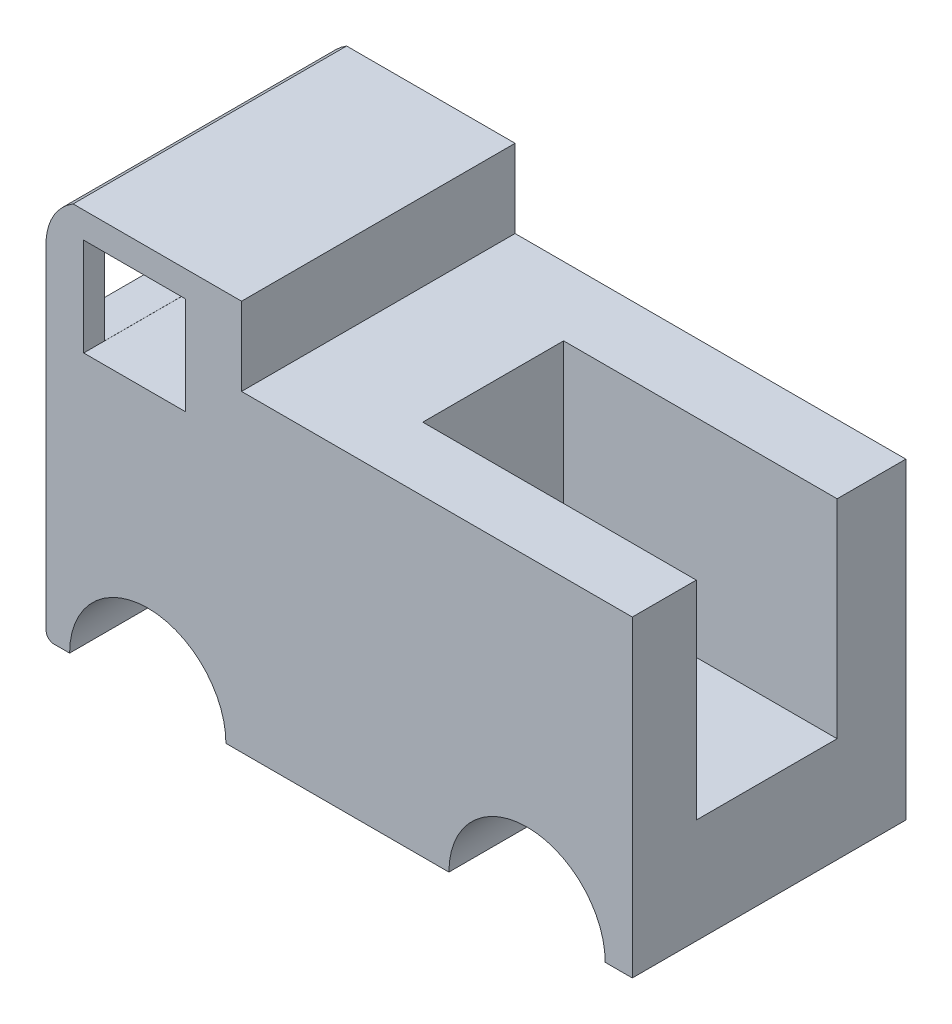
ISO-10303-21;
HEADER;
FILE_DESCRIPTION(('STEP AP214'),'2;1');
FILE_NAME('part.step','',(''),(''),'','','');
FILE_SCHEMA(('AUTOMOTIVE_DESIGN { 1 0 10303 214 1 1 1 1 }'));
ENDSEC;
DATA;
#1=APPLICATION_CONTEXT('core data for automotive mechanical design processes');
#2=APPLICATION_PROTOCOL_DEFINITION('international standard','automotive_design',2000,#1);
#3=PRODUCT_CONTEXT('',#1,'mechanical');
#4=PRODUCT('Part','Part','',(#3));
#5=PRODUCT_RELATED_PRODUCT_CATEGORY('part','',(#4));
#6=PRODUCT_DEFINITION_FORMATION('','',#4);
#7=PRODUCT_DEFINITION_CONTEXT('part definition',#1,'design');
#8=PRODUCT_DEFINITION('design','',#6,#7);
#9=PRODUCT_DEFINITION_SHAPE('','',#8);
#10=(LENGTH_UNIT() NAMED_UNIT(*) SI_UNIT(.MILLI.,.METRE.));
#11=(NAMED_UNIT(*) PLANE_ANGLE_UNIT() SI_UNIT($,.RADIAN.));
#12=(NAMED_UNIT(*) SI_UNIT($,.STERADIAN.) SOLID_ANGLE_UNIT());
#13=UNCERTAINTY_MEASURE_WITH_UNIT(LENGTH_MEASURE(1.E-05),#10,'distance_accuracy_value','');
#14=(GEOMETRIC_REPRESENTATION_CONTEXT(3) GLOBAL_UNCERTAINTY_ASSIGNED_CONTEXT((#13)) GLOBAL_UNIT_ASSIGNED_CONTEXT((#10,
#11,#12)) REPRESENTATION_CONTEXT('',''));
#15=CARTESIAN_POINT('',(0.,0.,0.));
#16=DIRECTION('',(0.,0.,1.));
#17=DIRECTION('',(1.,0.,0.));
#18=AXIS2_PLACEMENT_3D('',#15,#16,#17);
#19=CARTESIAN_POINT('',(10.0000000000002,-500.,-700.));
#20=DIRECTION('',(0.,0.,1.));
#21=DIRECTION('',(1.,0.,0.));
#22=AXIS2_PLACEMENT_3D('',#19,#20,#21);
#23=CYLINDRICAL_SURFACE('',#22,200.);
#24=CARTESIAN_POINT('',(10.0000000000002,-500.,0.));
#25=DIRECTION('',(0.,0.,1.));
#26=DIRECTION('',(1.,0.,0.));
#27=AXIS2_PLACEMENT_3D('',#24,#25,#26);
#28=CIRCLE('',#27,200.);
#29=CARTESIAN_POINT('',(210.,-500.,0.));
#30=VERTEX_POINT('',#29);
#31=CARTESIAN_POINT('',(-190.,-500.,0.));
#32=VERTEX_POINT('',#31);
#33=EDGE_CURVE('E331',#30,#32,#28,.T.);
#34=ORIENTED_EDGE('',*,*,#33,.T.);
#35=DIRECTION('',(0.,0.,1.));
#36=VECTOR('',#35,1.);
#37=CARTESIAN_POINT('',(-190.,-500.,-700.));
#38=LINE('',#37,#36);
#39=CARTESIAN_POINT('',(-190.,-500.,-700.));
#40=VERTEX_POINT('',#39);
#41=EDGE_CURVE('E261',#40,#32,#38,.T.);
#42=ORIENTED_EDGE('',*,*,#41,.F.);
#43=CARTESIAN_POINT('',(10.0000000000002,-500.,-700.));
#44=DIRECTION('',(0.,0.,1.));
#45=DIRECTION('',(1.,0.,0.));
#46=AXIS2_PLACEMENT_3D('',#43,#44,#45);
#47=CIRCLE('',#46,200.);
#48=CARTESIAN_POINT('',(210.,-500.,-700.));
#49=VERTEX_POINT('',#48);
#50=EDGE_CURVE('E339',#49,#40,#47,.T.);
#51=ORIENTED_EDGE('',*,*,#50,.F.);
#52=DIRECTION('',(0.,0.,1.));
#53=VECTOR('',#52,1.);
#54=CARTESIAN_POINT('',(210.,-500.,-700.));
#55=LINE('',#54,#53);
#56=EDGE_CURVE('E256',#49,#30,#55,.T.);
#57=ORIENTED_EDGE('',*,*,#56,.T.);
#58=EDGE_LOOP('',(#34,#42,#51,#57));
#59=FACE_BOUND('',#58,.T.);
#60=ADVANCED_FACE('F43',(#59),#23,.F.);
#61=CARTESIAN_POINT('',(0.,-500.,-700.));
#62=DIRECTION('',(0.,-1.,0.));
#63=DIRECTION('',(0.,0.,-1.));
#64=AXIS2_PLACEMENT_3D('',#61,#62,#63);
#65=PLANE('',#64);
#66=DIRECTION('',(1.,0.,0.));
#67=VECTOR('',#66,1.);
#68=CARTESIAN_POINT('',(0.,-500.,0.));
#69=LINE('',#68,#67);
#70=CARTESIAN_POINT('',(-230.,-500.,0.));
#71=VERTEX_POINT('',#70);
#72=EDGE_CURVE('E342',#71,#32,#69,.T.);
#73=ORIENTED_EDGE('',*,*,#72,.F.);
#74=DIRECTION('',(0.,0.,1.));
#75=VECTOR('',#74,1.);
#76=CARTESIAN_POINT('',(-230.,-500.,-700.));
#77=LINE('',#76,#75);
#78=CARTESIAN_POINT('',(-230.,-500.,-700.));
#79=VERTEX_POINT('',#78);
#80=EDGE_CURVE('E236',#79,#71,#77,.T.);
#81=ORIENTED_EDGE('',*,*,#80,.F.);
#82=DIRECTION('',(1.,0.,0.));
#83=VECTOR('',#82,1.);
#84=CARTESIAN_POINT('',(0.,-500.,-700.));
#85=LINE('',#84,#83);
#86=EDGE_CURVE('E258',#79,#40,#85,.T.);
#87=ORIENTED_EDGE('',*,*,#86,.T.);
#88=ORIENTED_EDGE('',*,*,#41,.T.);
#89=EDGE_LOOP('',(#73,#81,#87,#88));
#90=FACE_BOUND('',#89,.T.);
#91=ADVANCED_FACE('F413',(#90),#65,.T.);
#92=CARTESIAN_POINT('',(-230.,-480.,-700.));
#93=DIRECTION('',(0.,0.,1.));
#94=DIRECTION('',(1.,0.,0.));
#95=AXIS2_PLACEMENT_3D('',#92,#93,#94);
#96=CYLINDRICAL_SURFACE('',#95,20.);
#97=CARTESIAN_POINT('',(-230.,-480.,0.));
#98=DIRECTION('',(0.,0.,1.));
#99=DIRECTION('',(1.,0.,0.));
#100=AXIS2_PLACEMENT_3D('',#97,#98,#99);
#101=CIRCLE('',#100,20.);
#102=CARTESIAN_POINT('',(-250.,-480.,0.));
#103=VERTEX_POINT('',#102);
#104=EDGE_CURVE('E397',#103,#71,#101,.T.);
#105=ORIENTED_EDGE('',*,*,#104,.F.);
#106=DIRECTION('',(0.,0.,1.));
#107=VECTOR('',#106,1.);
#108=CARTESIAN_POINT('',(-250.,-480.,-700.));
#109=LINE('',#108,#107);
#110=CARTESIAN_POINT('',(-250.,-480.,-700.));
#111=VERTEX_POINT('',#110);
#112=EDGE_CURVE('E233',#111,#103,#109,.T.);
#113=ORIENTED_EDGE('',*,*,#112,.F.);
#114=CARTESIAN_POINT('',(-230.,-480.,-700.));
#115=DIRECTION('',(0.,0.,1.));
#116=DIRECTION('',(1.,0.,0.));
#117=AXIS2_PLACEMENT_3D('',#114,#115,#116);
#118=CIRCLE('',#117,20.);
#119=EDGE_CURVE('E363',#111,#79,#118,.T.);
#120=ORIENTED_EDGE('',*,*,#119,.T.);
#121=ORIENTED_EDGE('',*,*,#80,.T.);
#122=EDGE_LOOP('',(#105,#113,#120,#121));
#123=FACE_BOUND('',#122,.T.);
#124=ADVANCED_FACE('F404',(#123),#96,.T.);
#125=CARTESIAN_POINT('',(-250.,0.,-700.));
#126=DIRECTION('',(-1.,0.,0.));
#127=DIRECTION('',(0.,-1.,0.));
#128=AXIS2_PLACEMENT_3D('',#125,#126,#127);
#129=PLANE('',#128);
#130=DIRECTION('',(0.,1.,0.));
#131=VECTOR('',#130,1.);
#132=CARTESIAN_POINT('',(-250.,386.784176503035,-53.0281902046739));
#133=LINE('',#132,#131);
#134=CARTESIAN_POINT('',(-250.,183.526325219115,-53.0281902046739));
#135=VERTEX_POINT('',#134);
#136=CARTESIAN_POINT('',(-250.,386.784176503035,-53.0281902046739));
#137=VERTEX_POINT('',#136);
#138=EDGE_CURVE('E57',#135,#137,#133,.T.);
#139=ORIENTED_EDGE('',*,*,#138,.F.);
#140=DIRECTION('',(0.,0.,1.));
#141=VECTOR('',#140,1.);
#142=CARTESIAN_POINT('',(-250.,183.526325219115,-645.535873178943));
#143=LINE('',#142,#141);
#144=CARTESIAN_POINT('',(-250.,183.526325219115,-645.535873178943));
#145=VERTEX_POINT('',#144);
#146=EDGE_CURVE('E226',#145,#135,#143,.T.);
#147=ORIENTED_EDGE('',*,*,#146,.F.);
#148=DIRECTION('',(0.,-1.,0.));
#149=VECTOR('',#148,1.);
#150=CARTESIAN_POINT('',(-250.,386.784176503034,-645.535873178943));
#151=LINE('',#150,#149);
#152=CARTESIAN_POINT('',(-250.,386.784176503034,-645.535873178943));
#153=VERTEX_POINT('',#152);
#154=EDGE_CURVE('E206',#153,#145,#151,.T.);
#155=ORIENTED_EDGE('',*,*,#154,.F.);
#156=DIRECTION('',(0.,0.,1.));
#157=VECTOR('',#156,1.);
#158=CARTESIAN_POINT('',(-250.,386.784176503035,-700.));
#159=LINE('',#158,#157);
#160=CARTESIAN_POINT('',(-250.,386.784176503035,-700.));
#161=VERTEX_POINT('',#160);
#162=EDGE_CURVE('E223',#161,#153,#159,.T.);
#163=ORIENTED_EDGE('',*,*,#162,.F.);
#164=DIRECTION('',(0.,-1.,0.));
#165=VECTOR('',#164,1.);
#166=CARTESIAN_POINT('',(-250.,0.,-700.));
#167=LINE('',#166,#165);
#168=EDGE_CURVE('E361',#161,#111,#167,.T.);
#169=ORIENTED_EDGE('',*,*,#168,.T.);
#170=ORIENTED_EDGE('',*,*,#112,.T.);
#171=DIRECTION('',(0.,-1.,0.));
#172=VECTOR('',#171,1.);
#173=CARTESIAN_POINT('',(-250.,0.,0.));
#174=LINE('',#173,#172);
#175=CARTESIAN_POINT('',(-250.,386.784176503035,0.));
#176=VERTEX_POINT('',#175);
#177=EDGE_CURVE('E394',#176,#103,#174,.T.);
#178=ORIENTED_EDGE('',*,*,#177,.F.);
#179=EDGE_CURVE('E234',#137,#176,#159,.T.);
#180=ORIENTED_EDGE('',*,*,#179,.F.);
#181=EDGE_LOOP('',(#139,#147,#155,#163,#169,#170,#178,#180));
#182=FACE_BOUND('',#181,.T.);
#183=ADVANCED_FACE('F221',(#182),#129,.T.);
#184=CARTESIAN_POINT('',(-106.260373308993,376.87826237485,-700.));
#185=DIRECTION('',(0.,0.,1.));
#186=DIRECTION('',(1.,0.,0.));
#187=AXIS2_PLACEMENT_3D('',#184,#185,#186);
#188=CYLINDRICAL_SURFACE('',#187,144.080558771768);
#189=CARTESIAN_POINT('',(-106.260373308993,376.87826237485,0.));
#190=DIRECTION('',(0.,0.,1.));
#191=DIRECTION('',(1.,0.,0.));
#192=AXIS2_PLACEMENT_3D('',#189,#190,#191);
#193=CIRCLE('',#192,144.080558771768);
#194=CARTESIAN_POINT('',(-181.095158938062,500.,0.));
#195=VERTEX_POINT('',#194);
#196=EDGE_CURVE('E391',#195,#176,#193,.T.);
#197=ORIENTED_EDGE('',*,*,#196,.F.);
#198=DIRECTION('',(0.,0.,1.));
#199=VECTOR('',#198,1.);
#200=CARTESIAN_POINT('',(-181.095158938062,500.,-700.));
#201=LINE('',#200,#199);
#202=CARTESIAN_POINT('',(-181.095158938062,500.,-700.));
#203=VERTEX_POINT('',#202);
#204=EDGE_CURVE('E238',#203,#195,#201,.T.);
#205=ORIENTED_EDGE('',*,*,#204,.F.);
#206=CARTESIAN_POINT('',(-106.260373308993,376.87826237485,-700.));
#207=DIRECTION('',(0.,0.,1.));
#208=DIRECTION('',(1.,0.,0.));
#209=AXIS2_PLACEMENT_3D('',#206,#207,#208);
#210=CIRCLE('',#209,144.080558771768);
#211=EDGE_CURVE('E232',#203,#161,#210,.T.);
#212=ORIENTED_EDGE('',*,*,#211,.T.);
#213=ORIENTED_EDGE('',*,*,#162,.T.);
#214=DIRECTION('',(0.,0.,-1.));
#215=VECTOR('',#214,1.);
#216=CARTESIAN_POINT('',(-250.,386.784176503034,-645.535873178943));
#217=LINE('',#216,#215);
#218=EDGE_CURVE('E213',#137,#153,#217,.T.);
#219=ORIENTED_EDGE('',*,*,#218,.F.);
#220=ORIENTED_EDGE('',*,*,#179,.T.);
#221=EDGE_LOOP('',(#197,#205,#212,#213,#219,#220));
#222=FACE_BOUND('',#221,.T.);
#223=ADVANCED_FACE('F230',(#222),#188,.T.);
#224=CARTESIAN_POINT('',(0.,500.,-700.));
#225=DIRECTION('',(0.,-1.,0.));
#226=DIRECTION('',(0.,0.,-1.));
#227=AXIS2_PLACEMENT_3D('',#224,#225,#226);
#228=PLANE('',#227);
#229=DIRECTION('',(1.,0.,0.));
#230=VECTOR('',#229,1.);
#231=CARTESIAN_POINT('',(0.,500.,0.));
#232=LINE('',#231,#230);
#233=CARTESIAN_POINT('',(250.,500.,0.));
#234=VERTEX_POINT('',#233);
#235=EDGE_CURVE('E388',#195,#234,#232,.T.);
#236=ORIENTED_EDGE('',*,*,#235,.T.);
#237=DIRECTION('',(0.,0.,1.));
#238=VECTOR('',#237,1.);
#239=CARTESIAN_POINT('',(250.,500.,-700.));
#240=LINE('',#239,#238);
#241=CARTESIAN_POINT('',(250.,500.,-700.));
#242=VERTEX_POINT('',#241);
#243=EDGE_CURVE('E242',#242,#234,#240,.T.);
#244=ORIENTED_EDGE('',*,*,#243,.F.);
#245=DIRECTION('',(1.,0.,0.));
#246=VECTOR('',#245,1.);
#247=CARTESIAN_POINT('',(0.,500.,-700.));
#248=LINE('',#247,#246);
#249=EDGE_CURVE('E358',#203,#242,#248,.T.);
#250=ORIENTED_EDGE('',*,*,#249,.F.);
#251=ORIENTED_EDGE('',*,*,#204,.T.);
#252=EDGE_LOOP('',(#236,#244,#250,#251));
#253=FACE_BOUND('',#252,.T.);
#254=ADVANCED_FACE('F447',(#253),#228,.F.);
#255=CARTESIAN_POINT('',(250.,0.,-700.));
#256=DIRECTION('',(1.,0.,0.));
#257=DIRECTION('',(0.,1.,0.));
#258=AXIS2_PLACEMENT_3D('',#255,#256,#257);
#259=PLANE('',#258);
#260=DIRECTION('',(0.,1.,0.));
#261=VECTOR('',#260,1.);
#262=CARTESIAN_POINT('',(250.,0.,0.));
#263=LINE('',#262,#261);
#264=CARTESIAN_POINT('',(250.,300.,0.));
#265=VERTEX_POINT('',#264);
#266=EDGE_CURVE('E385',#265,#234,#263,.T.);
#267=ORIENTED_EDGE('',*,*,#266,.F.);
#268=DIRECTION('',(0.,0.,1.));
#269=VECTOR('',#268,1.);
#270=CARTESIAN_POINT('',(250.,300.,-700.));
#271=LINE('',#270,#269);
#272=CARTESIAN_POINT('',(250.,300.,-700.));
#273=VERTEX_POINT('',#272);
#274=EDGE_CURVE('E244',#273,#265,#271,.T.);
#275=ORIENTED_EDGE('',*,*,#274,.F.);
#276=DIRECTION('',(0.,1.,0.));
#277=VECTOR('',#276,1.);
#278=CARTESIAN_POINT('',(250.,0.,-700.));
#279=LINE('',#278,#277);
#280=EDGE_CURVE('E355',#273,#242,#279,.T.);
#281=ORIENTED_EDGE('',*,*,#280,.T.);
#282=ORIENTED_EDGE('',*,*,#243,.T.);
#283=EDGE_LOOP('',(#267,#275,#281,#282));
#284=FACE_BOUND('',#283,.T.);
#285=ADVANCED_FACE('F441',(#284),#259,.T.);
#286=CARTESIAN_POINT('',(0.,300.,-700.));
#287=DIRECTION('',(0.,-1.,0.));
#288=DIRECTION('',(1.,0.,0.));
#289=AXIS2_PLACEMENT_3D('',#286,#287,#288);
#290=PLANE('',#289);
#291=DIRECTION('',(0.,0.,1.));
#292=VECTOR('',#291,1.);
#293=CARTESIAN_POINT('',(1250.,300.,-700.));
#294=LINE('',#293,#292);
#295=CARTESIAN_POINT('',(1250.,300.000000000001,-163.74525814499));
#296=VERTEX_POINT('',#295);
#297=CARTESIAN_POINT('',(1250.,300.,0.));
#298=VERTEX_POINT('',#297);
#299=EDGE_CURVE('E249',#296,#298,#294,.T.);
#300=ORIENTED_EDGE('',*,*,#299,.F.);
#301=DIRECTION('',(1.,0.,0.));
#302=VECTOR('',#301,1.);
#303=CARTESIAN_POINT('',(550.,300.,-163.74525814499));
#304=LINE('',#303,#302);
#305=CARTESIAN_POINT('',(550.,300.,-163.74525814499));
#306=VERTEX_POINT('',#305);
#307=EDGE_CURVE('E329',#306,#296,#304,.T.);
#308=ORIENTED_EDGE('',*,*,#307,.F.);
#309=DIRECTION('',(0.,0.,1.));
#310=VECTOR('',#309,1.);
#311=CARTESIAN_POINT('',(550.,300.,-163.74525814499));
#312=LINE('',#311,#310);
#313=CARTESIAN_POINT('',(550.,300.,-524.195082310441));
#314=VERTEX_POINT('',#313);
#315=EDGE_CURVE('E320',#314,#306,#312,.T.);
#316=ORIENTED_EDGE('',*,*,#315,.F.);
#317=DIRECTION('',(1.,0.,0.));
#318=VECTOR('',#317,1.);
#319=CARTESIAN_POINT('',(550.,300.,-524.195082310441));
#320=LINE('',#319,#318);
#321=CARTESIAN_POINT('',(1250.,300.000000000001,-524.195082310441));
#322=VERTEX_POINT('',#321);
#323=EDGE_CURVE('E332',#314,#322,#320,.T.);
#324=ORIENTED_EDGE('',*,*,#323,.T.);
#325=CARTESIAN_POINT('',(1250.,300.,-700.));
#326=VERTEX_POINT('',#325);
#327=EDGE_CURVE('E246',#326,#322,#294,.T.);
#328=ORIENTED_EDGE('',*,*,#327,.F.);
#329=DIRECTION('',(1.,0.,0.));
#330=VECTOR('',#329,1.);
#331=CARTESIAN_POINT('',(0.,300.,-700.));
#332=LINE('',#331,#330);
#333=EDGE_CURVE('E353',#273,#326,#332,.T.);
#334=ORIENTED_EDGE('',*,*,#333,.F.);
#335=ORIENTED_EDGE('',*,*,#274,.T.);
#336=DIRECTION('',(1.,0.,0.));
#337=VECTOR('',#336,1.);
#338=CARTESIAN_POINT('',(0.,300.,0.));
#339=LINE('',#338,#337);
#340=EDGE_CURVE('E382',#265,#298,#339,.T.);
#341=ORIENTED_EDGE('',*,*,#340,.T.);
#342=EDGE_LOOP('',(#300,#308,#316,#324,#328,#334,#335,#341));
#343=FACE_BOUND('',#342,.T.);
#344=ADVANCED_FACE('F453',(#343),#290,.F.);
#345=CARTESIAN_POINT('',(1250.,6.93889390390723E-13,-700.));
#346=DIRECTION('',(1.,0.,0.));
#347=DIRECTION('',(0.,1.,0.));
#348=AXIS2_PLACEMENT_3D('',#345,#346,#347);
#349=PLANE('',#348);
#350=DIRECTION('',(0.,-1.,0.));
#351=VECTOR('',#350,1.);
#352=CARTESIAN_POINT('',(1250.,300.000000000001,-163.74525814499));
#353=LINE('',#352,#351);
#354=CARTESIAN_POINT('',(1250.,-231.813455690043,-163.74525814499));
#355=VERTEX_POINT('',#354);
#356=EDGE_CURVE('E303',#296,#355,#353,.T.);
#357=ORIENTED_EDGE('',*,*,#356,.F.);
#358=ORIENTED_EDGE('',*,*,#299,.T.);
#359=DIRECTION('',(0.,1.,0.));
#360=VECTOR('',#359,1.);
#361=CARTESIAN_POINT('',(1250.,6.93889390390723E-13,0.));
#362=LINE('',#361,#360);
#363=CARTESIAN_POINT('',(1250.,-500.,0.));
#364=VERTEX_POINT('',#363);
#365=EDGE_CURVE('E379',#364,#298,#362,.T.);
#366=ORIENTED_EDGE('',*,*,#365,.F.);
#367=DIRECTION('',(0.,0.,1.));
#368=VECTOR('',#367,1.);
#369=CARTESIAN_POINT('',(1250.,-500.,-700.));
#370=LINE('',#369,#368);
#371=CARTESIAN_POINT('',(1250.,-500.,-700.));
#372=VERTEX_POINT('',#371);
#373=EDGE_CURVE('E250',#372,#364,#370,.T.);
#374=ORIENTED_EDGE('',*,*,#373,.F.);
#375=DIRECTION('',(0.,1.,0.));
#376=VECTOR('',#375,1.);
#377=CARTESIAN_POINT('',(1250.,6.93889390390723E-13,-700.));
#378=LINE('',#377,#376);
#379=EDGE_CURVE('E350',#372,#326,#378,.T.);
#380=ORIENTED_EDGE('',*,*,#379,.T.);
#381=ORIENTED_EDGE('',*,*,#327,.T.);
#382=DIRECTION('',(0.,1.,0.));
#383=VECTOR('',#382,1.);
#384=CARTESIAN_POINT('',(1250.,300.000000000001,-524.195082310441));
#385=LINE('',#384,#383);
#386=CARTESIAN_POINT('',(1250.,-231.813455690043,-524.195082310441));
#387=VERTEX_POINT('',#386);
#388=EDGE_CURVE('E314',#387,#322,#385,.T.);
#389=ORIENTED_EDGE('',*,*,#388,.F.);
#390=DIRECTION('',(0.,0.,-1.));
#391=VECTOR('',#390,1.);
#392=CARTESIAN_POINT('',(1250.,-231.813455690043,-163.74525814499));
#393=LINE('',#392,#391);
#394=EDGE_CURVE('E325',#355,#387,#393,.T.);
#395=ORIENTED_EDGE('',*,*,#394,.F.);
#396=EDGE_LOOP('',(#357,#358,#366,#374,#380,#381,#389,#395));
#397=FACE_BOUND('',#396,.T.);
#398=ADVANCED_FACE('F434',(#397),#349,.T.);
#399=CARTESIAN_POINT('',(0.,-500.,-700.));
#400=DIRECTION('',(0.,-1.,0.));
#401=DIRECTION('',(0.,0.,-1.));
#402=AXIS2_PLACEMENT_3D('',#399,#400,#401);
#403=PLANE('',#402);
#404=DIRECTION('',(1.,0.,0.));
#405=VECTOR('',#404,1.);
#406=CARTESIAN_POINT('',(0.,-500.,0.));
#407=LINE('',#406,#405);
#408=CARTESIAN_POINT('',(1180.67294049189,-500.,0.));
#409=VERTEX_POINT('',#408);
#410=EDGE_CURVE('E376',#409,#364,#407,.T.);
#411=ORIENTED_EDGE('',*,*,#410,.F.);
#412=DIRECTION('',(0.,0.,1.));
#413=VECTOR('',#412,1.);
#414=CARTESIAN_POINT('',(1180.67294049189,-500.,-700.));
#415=LINE('',#414,#413);
#416=CARTESIAN_POINT('',(1180.67294049189,-500.,-700.));
#417=VERTEX_POINT('',#416);
#418=EDGE_CURVE('E252',#417,#409,#415,.T.);
#419=ORIENTED_EDGE('',*,*,#418,.F.);
#420=DIRECTION('',(1.,0.,0.));
#421=VECTOR('',#420,1.);
#422=CARTESIAN_POINT('',(0.,-500.,-700.));
#423=LINE('',#422,#421);
#424=EDGE_CURVE('E347',#417,#372,#423,.T.);
#425=ORIENTED_EDGE('',*,*,#424,.T.);
#426=ORIENTED_EDGE('',*,*,#373,.T.);
#427=EDGE_LOOP('',(#411,#419,#425,#426));
#428=FACE_BOUND('',#427,.T.);
#429=ADVANCED_FACE('F428',(#428),#403,.T.);
#430=CARTESIAN_POINT('',(980.672940491885,-500.,-700.));
#431=DIRECTION('',(0.,0.,1.));
#432=DIRECTION('',(1.,0.,0.));
#433=AXIS2_PLACEMENT_3D('',#430,#431,#432);
#434=CYLINDRICAL_SURFACE('',#433,200.);
#435=CARTESIAN_POINT('',(980.672940491885,-500.,0.));
#436=DIRECTION('',(0.,0.,1.));
#437=DIRECTION('',(1.,0.,0.));
#438=AXIS2_PLACEMENT_3D('',#435,#436,#437);
#439=CIRCLE('',#438,200.);
#440=CARTESIAN_POINT('',(780.672940491885,-500.,0.));
#441=VERTEX_POINT('',#440);
#442=EDGE_CURVE('E373',#409,#441,#439,.T.);
#443=ORIENTED_EDGE('',*,*,#442,.T.);
#444=DIRECTION('',(0.,0.,1.));
#445=VECTOR('',#444,1.);
#446=CARTESIAN_POINT('',(780.672940491885,-500.,-700.));
#447=LINE('',#446,#445);
#448=CARTESIAN_POINT('',(780.672940491885,-500.,-700.));
#449=VERTEX_POINT('',#448);
#450=EDGE_CURVE('E254',#449,#441,#447,.T.);
#451=ORIENTED_EDGE('',*,*,#450,.F.);
#452=CARTESIAN_POINT('',(980.672940491885,-500.,-700.));
#453=DIRECTION('',(0.,0.,1.));
#454=DIRECTION('',(1.,0.,0.));
#455=AXIS2_PLACEMENT_3D('',#452,#453,#454);
#456=CIRCLE('',#455,200.);
#457=EDGE_CURVE('E345',#417,#449,#456,.T.);
#458=ORIENTED_EDGE('',*,*,#457,.F.);
#459=ORIENTED_EDGE('',*,*,#418,.T.);
#460=EDGE_LOOP('',(#443,#451,#458,#459));
#461=FACE_BOUND('',#460,.T.);
#462=ADVANCED_FACE('F425',(#461),#434,.F.);
#463=CARTESIAN_POINT('',(0.,-500.,-700.));
#464=DIRECTION('',(0.,-1.,0.));
#465=DIRECTION('',(0.,0.,-1.));
#466=AXIS2_PLACEMENT_3D('',#463,#464,#465);
#467=PLANE('',#466);
#468=DIRECTION('',(1.,0.,0.));
#469=VECTOR('',#468,1.);
#470=CARTESIAN_POINT('',(0.,-500.,0.));
#471=LINE('',#470,#469);
#472=EDGE_CURVE('E370',#30,#441,#471,.T.);
#473=ORIENTED_EDGE('',*,*,#472,.F.);
#474=ORIENTED_EDGE('',*,*,#56,.F.);
#475=DIRECTION('',(1.,0.,0.));
#476=VECTOR('',#475,1.);
#477=CARTESIAN_POINT('',(0.,-500.,-700.));
#478=LINE('',#477,#476);
#479=EDGE_CURVE('E341',#49,#449,#478,.T.);
#480=ORIENTED_EDGE('',*,*,#479,.T.);
#481=ORIENTED_EDGE('',*,*,#450,.T.);
#482=EDGE_LOOP('',(#473,#474,#480,#481));
#483=FACE_BOUND('',#482,.T.);
#484=ADVANCED_FACE('F420',(#483),#467,.T.);
#485=CARTESIAN_POINT('',(0.,0.,-700.));
#486=DIRECTION('',(0.,0.,1.));
#487=DIRECTION('',(1.,0.,0.));
#488=AXIS2_PLACEMENT_3D('',#485,#486,#487);
#489=PLANE('',#488);
#490=DIRECTION('',(-1.,0.,0.));
#491=VECTOR('',#490,1.);
#492=CARTESIAN_POINT('',(107.056093172793,183.270280654589,-700.));
#493=LINE('',#492,#491);
#494=CARTESIAN_POINT('',(107.056093172793,183.270280654589,-700.));
#495=VERTEX_POINT('',#494);
#496=CARTESIAN_POINT('',(-153.871086064245,183.270280654589,-700.));
#497=VERTEX_POINT('',#496);
#498=EDGE_CURVE('E293',#495,#497,#493,.T.);
#499=ORIENTED_EDGE('',*,*,#498,.F.);
#500=DIRECTION('',(0.,-1.,0.));
#501=VECTOR('',#500,1.);
#502=CARTESIAN_POINT('',(107.056093172793,433.325494090084,-700.));
#503=LINE('',#502,#501);
#504=CARTESIAN_POINT('',(107.056093172793,433.325494090084,-700.));
#505=VERTEX_POINT('',#504);
#506=EDGE_CURVE('E273',#505,#495,#503,.T.);
#507=ORIENTED_EDGE('',*,*,#506,.F.);
#508=DIRECTION('',(1.,0.,0.));
#509=VECTOR('',#508,1.);
#510=CARTESIAN_POINT('',(107.056093172793,433.325494090084,-700.));
#511=LINE('',#510,#509);
#512=CARTESIAN_POINT('',(-153.871086064245,433.325494090084,-700.));
#513=VERTEX_POINT('',#512);
#514=EDGE_CURVE('E282',#513,#505,#511,.T.);
#515=ORIENTED_EDGE('',*,*,#514,.F.);
#516=DIRECTION('',(0.,1.,0.));
#517=VECTOR('',#516,1.);
#518=CARTESIAN_POINT('',(-153.871086064245,433.325494090084,-700.));
#519=LINE('',#518,#517);
#520=EDGE_CURVE('E296',#497,#513,#519,.T.);
#521=ORIENTED_EDGE('',*,*,#520,.F.);
#522=EDGE_LOOP('',(#499,#507,#515,#521));
#523=FACE_BOUND('',#522,.T.);
#524=ORIENTED_EDGE('',*,*,#50,.T.);
#525=ORIENTED_EDGE('',*,*,#86,.F.);
#526=ORIENTED_EDGE('',*,*,#119,.F.);
#527=ORIENTED_EDGE('',*,*,#168,.F.);
#528=ORIENTED_EDGE('',*,*,#211,.F.);
#529=ORIENTED_EDGE('',*,*,#249,.T.);
#530=ORIENTED_EDGE('',*,*,#280,.F.);
#531=ORIENTED_EDGE('',*,*,#333,.T.);
#532=ORIENTED_EDGE('',*,*,#379,.F.);
#533=ORIENTED_EDGE('',*,*,#424,.F.);
#534=ORIENTED_EDGE('',*,*,#457,.T.);
#535=ORIENTED_EDGE('',*,*,#479,.F.);
#536=EDGE_LOOP('',(#524,#525,#526,#527,#528,#529,#530,#531,#532,#533,#534,#535));
#537=FACE_BOUND('',#536,.T.);
#538=ADVANCED_FACE('F449',(#523,#537),#489,.F.);
#539=CARTESIAN_POINT('',(0.,0.,0.));
#540=DIRECTION('',(0.,0.,1.));
#541=DIRECTION('',(1.,0.,0.));
#542=AXIS2_PLACEMENT_3D('',#539,#540,#541);
#543=PLANE('',#542);
#544=DIRECTION('',(0.,-1.,0.));
#545=VECTOR('',#544,1.);
#546=CARTESIAN_POINT('',(107.056093172793,433.325494090084,0.));
#547=LINE('',#546,#545);
#548=CARTESIAN_POINT('',(107.056093172793,433.325494090084,0.));
#549=VERTEX_POINT('',#548);
#550=CARTESIAN_POINT('',(107.056093172793,183.270280654589,0.));
#551=VERTEX_POINT('',#550);
#552=EDGE_CURVE('E278',#549,#551,#547,.T.);
#553=ORIENTED_EDGE('',*,*,#552,.T.);
#554=DIRECTION('',(-1.,0.,0.));
#555=VECTOR('',#554,1.);
#556=CARTESIAN_POINT('',(107.056093172793,183.270280654589,0.));
#557=LINE('',#556,#555);
#558=CARTESIAN_POINT('',(-153.871086064245,183.270280654589,0.));
#559=VERTEX_POINT('',#558);
#560=EDGE_CURVE('E281',#551,#559,#557,.T.);
#561=ORIENTED_EDGE('',*,*,#560,.T.);
#562=DIRECTION('',(0.,1.,0.));
#563=VECTOR('',#562,1.);
#564=CARTESIAN_POINT('',(-153.871086064245,433.325494090084,0.));
#565=LINE('',#564,#563);
#566=CARTESIAN_POINT('',(-153.871086064245,433.325494090084,0.));
#567=VERTEX_POINT('',#566);
#568=EDGE_CURVE('E285',#559,#567,#565,.T.);
#569=ORIENTED_EDGE('',*,*,#568,.T.);
#570=DIRECTION('',(1.,0.,0.));
#571=VECTOR('',#570,1.);
#572=CARTESIAN_POINT('',(107.056093172793,433.325494090084,0.));
#573=LINE('',#572,#571);
#574=EDGE_CURVE('E288',#567,#549,#573,.T.);
#575=ORIENTED_EDGE('',*,*,#574,.T.);
#576=EDGE_LOOP('',(#553,#561,#569,#575));
#577=FACE_BOUND('',#576,.T.);
#578=ORIENTED_EDGE('',*,*,#33,.F.);
#579=ORIENTED_EDGE('',*,*,#472,.T.);
#580=ORIENTED_EDGE('',*,*,#442,.F.);
#581=ORIENTED_EDGE('',*,*,#410,.T.);
#582=ORIENTED_EDGE('',*,*,#365,.T.);
#583=ORIENTED_EDGE('',*,*,#340,.F.);
#584=ORIENTED_EDGE('',*,*,#266,.T.);
#585=ORIENTED_EDGE('',*,*,#235,.F.);
#586=ORIENTED_EDGE('',*,*,#196,.T.);
#587=ORIENTED_EDGE('',*,*,#177,.T.);
#588=ORIENTED_EDGE('',*,*,#104,.T.);
#589=ORIENTED_EDGE('',*,*,#72,.T.);
#590=EDGE_LOOP('',(#578,#579,#580,#581,#582,#583,#584,#585,#586,#587,#588,#589));
#591=FACE_BOUND('',#590,.T.);
#592=ADVANCED_FACE('F411',(#577,#591),#543,.T.);
#593=CARTESIAN_POINT('',(550.,300.,-163.74525814499));
#594=DIRECTION('',(0.,0.,1.));
#595=DIRECTION('',(1.,0.,0.));
#596=AXIS2_PLACEMENT_3D('',#593,#594,#595);
#597=PLANE('',#596);
#598=ORIENTED_EDGE('',*,*,#356,.T.);
#599=DIRECTION('',(1.,0.,0.));
#600=VECTOR('',#599,1.);
#601=CARTESIAN_POINT('',(550.,-231.813455690043,-163.74525814499));
#602=LINE('',#601,#600);
#603=CARTESIAN_POINT('',(550.,-231.813455690043,-163.74525814499));
#604=VERTEX_POINT('',#603);
#605=EDGE_CURVE('E323',#604,#355,#602,.T.);
#606=ORIENTED_EDGE('',*,*,#605,.F.);
#607=DIRECTION('',(0.,-1.,0.));
#608=VECTOR('',#607,1.);
#609=CARTESIAN_POINT('',(550.,300.,-163.74525814499));
#610=LINE('',#609,#608);
#611=EDGE_CURVE('E310',#306,#604,#610,.T.);
#612=ORIENTED_EDGE('',*,*,#611,.F.);
#613=ORIENTED_EDGE('',*,*,#307,.T.);
#614=EDGE_LOOP('',(#598,#606,#612,#613));
#615=FACE_BOUND('',#614,.T.);
#616=ADVANCED_FACE('F465',(#615),#597,.F.);
#617=CARTESIAN_POINT('',(550.,300.,-524.195082310441));
#618=DIRECTION('',(0.,0.,-1.));
#619=DIRECTION('',(-1.,0.,0.));
#620=AXIS2_PLACEMENT_3D('',#617,#618,#619);
#621=PLANE('',#620);
#622=ORIENTED_EDGE('',*,*,#388,.T.);
#623=ORIENTED_EDGE('',*,*,#323,.F.);
#624=DIRECTION('',(0.,1.,0.));
#625=VECTOR('',#624,1.);
#626=CARTESIAN_POINT('',(550.,300.,-524.195082310441));
#627=LINE('',#626,#625);
#628=CARTESIAN_POINT('',(550.,-231.813455690043,-524.195082310441));
#629=VERTEX_POINT('',#628);
#630=EDGE_CURVE('E317',#629,#314,#627,.T.);
#631=ORIENTED_EDGE('',*,*,#630,.F.);
#632=DIRECTION('',(1.,0.,0.));
#633=VECTOR('',#632,1.);
#634=CARTESIAN_POINT('',(550.,-231.813455690043,-524.195082310441));
#635=LINE('',#634,#633);
#636=EDGE_CURVE('E335',#629,#387,#635,.T.);
#637=ORIENTED_EDGE('',*,*,#636,.T.);
#638=EDGE_LOOP('',(#622,#623,#631,#637));
#639=FACE_BOUND('',#638,.T.);
#640=ADVANCED_FACE('F458',(#639),#621,.F.);
#641=CARTESIAN_POINT('',(550.,-231.813455690043,-163.74525814499));
#642=DIRECTION('',(0.,-1.,0.));
#643=DIRECTION('',(1.,0.,0.));
#644=AXIS2_PLACEMENT_3D('',#641,#642,#643);
#645=PLANE('',#644);
#646=ORIENTED_EDGE('',*,*,#394,.T.);
#647=ORIENTED_EDGE('',*,*,#636,.F.);
#648=DIRECTION('',(0.,0.,-1.));
#649=VECTOR('',#648,1.);
#650=CARTESIAN_POINT('',(550.,-231.813455690043,-163.74525814499));
#651=LINE('',#650,#649);
#652=EDGE_CURVE('E313',#604,#629,#651,.T.);
#653=ORIENTED_EDGE('',*,*,#652,.F.);
#654=ORIENTED_EDGE('',*,*,#605,.T.);
#655=EDGE_LOOP('',(#646,#647,#653,#654));
#656=FACE_BOUND('',#655,.T.);
#657=ADVANCED_FACE('F463',(#656),#645,.F.);
#658=CARTESIAN_POINT('',(550.,6.55230642295512E-13,0.));
#659=DIRECTION('',(1.,0.,0.));
#660=DIRECTION('',(0.,1.,0.));
#661=AXIS2_PLACEMENT_3D('',#658,#659,#660);
#662=PLANE('',#661);
#663=ORIENTED_EDGE('',*,*,#611,.T.);
#664=ORIENTED_EDGE('',*,*,#652,.T.);
#665=ORIENTED_EDGE('',*,*,#630,.T.);
#666=ORIENTED_EDGE('',*,*,#315,.T.);
#667=EDGE_LOOP('',(#663,#664,#665,#666));
#668=FACE_BOUND('',#667,.T.);
#669=ADVANCED_FACE('F460',(#668),#662,.T.);
#670=CARTESIAN_POINT('',(107.056093172793,433.325494090084,0.));
#671=DIRECTION('',(1.,0.,0.));
#672=DIRECTION('',(0.,0.,-1.));
#673=AXIS2_PLACEMENT_3D('',#670,#671,#672);
#674=PLANE('',#673);
#675=ORIENTED_EDGE('',*,*,#506,.T.);
#676=DIRECTION('',(0.,0.,-1.));
#677=VECTOR('',#676,1.);
#678=CARTESIAN_POINT('',(107.056093172793,183.270280654589,0.));
#679=LINE('',#678,#677);
#680=EDGE_CURVE('E291',#551,#495,#679,.T.);
#681=ORIENTED_EDGE('',*,*,#680,.F.);
#682=ORIENTED_EDGE('',*,*,#552,.F.);
#683=DIRECTION('',(0.,0.,-1.));
#684=VECTOR('',#683,1.);
#685=CARTESIAN_POINT('',(107.056093172793,433.325494090084,0.));
#686=LINE('',#685,#684);
#687=EDGE_CURVE('E301',#549,#505,#686,.T.);
#688=ORIENTED_EDGE('',*,*,#687,.T.);
#689=EDGE_LOOP('',(#675,#681,#682,#688));
#690=FACE_BOUND('',#689,.T.);
#691=ADVANCED_FACE('F519',(#690),#674,.F.);
#692=CARTESIAN_POINT('',(107.056093172793,433.325494090084,0.));
#693=DIRECTION('',(0.,1.,0.));
#694=DIRECTION('',(0.,0.,1.));
#695=AXIS2_PLACEMENT_3D('',#692,#693,#694);
#696=PLANE('',#695);
#697=ORIENTED_EDGE('',*,*,#514,.T.);
#698=ORIENTED_EDGE('',*,*,#687,.F.);
#699=ORIENTED_EDGE('',*,*,#574,.F.);
#700=DIRECTION('',(0.,0.,-1.));
#701=VECTOR('',#700,1.);
#702=CARTESIAN_POINT('',(-153.871086064245,433.325494090084,0.));
#703=LINE('',#702,#701);
#704=EDGE_CURVE('E304',#567,#513,#703,.T.);
#705=ORIENTED_EDGE('',*,*,#704,.T.);
#706=EDGE_LOOP('',(#697,#698,#699,#705));
#707=FACE_BOUND('',#706,.T.);
#708=ADVANCED_FACE('F522',(#707),#696,.F.);
#709=CARTESIAN_POINT('',(-153.871086064245,433.325494090084,0.));
#710=DIRECTION('',(-1.,0.,0.));
#711=DIRECTION('',(0.,0.,1.));
#712=AXIS2_PLACEMENT_3D('',#709,#710,#711);
#713=PLANE('',#712);
#714=DIRECTION('',(0.,1.,0.));
#715=VECTOR('',#714,1.);
#716=CARTESIAN_POINT('',(-153.871086064245,433.325494090084,-53.0281902046739));
#717=LINE('',#716,#715);
#718=CARTESIAN_POINT('',(-153.871086064245,183.526325219115,-53.0281902046739));
#719=VERTEX_POINT('',#718);
#720=CARTESIAN_POINT('',(-153.871086064245,386.784176503035,-53.0281902046739));
#721=VERTEX_POINT('',#720);
#722=EDGE_CURVE('E50',#719,#721,#717,.T.);
#723=ORIENTED_EDGE('',*,*,#722,.T.);
#724=DIRECTION('',(0.,0.,-1.));
#725=VECTOR('',#724,1.);
#726=CARTESIAN_POINT('',(-153.871086064245,386.784176503035,0.));
#727=LINE('',#726,#725);
#728=CARTESIAN_POINT('',(-153.871086064245,386.784176503034,-645.535873178943));
#729=VERTEX_POINT('',#728);
#730=EDGE_CURVE('E11',#721,#729,#727,.T.);
#731=ORIENTED_EDGE('',*,*,#730,.T.);
#732=DIRECTION('',(0.,-1.,0.));
#733=VECTOR('',#732,1.);
#734=CARTESIAN_POINT('',(-153.871086064245,433.325494090084,-645.535873178943));
#735=LINE('',#734,#733);
#736=CARTESIAN_POINT('',(-153.871086064245,183.526325219115,-645.535873178943));
#737=VERTEX_POINT('',#736);
#738=EDGE_CURVE('E209',#729,#737,#735,.T.);
#739=ORIENTED_EDGE('',*,*,#738,.T.);
#740=DIRECTION('',(0.,0.,1.));
#741=VECTOR('',#740,1.);
#742=CARTESIAN_POINT('',(-153.871086064245,183.526325219115,0.));
#743=LINE('',#742,#741);
#744=EDGE_CURVE('E260',#737,#719,#743,.T.);
#745=ORIENTED_EDGE('',*,*,#744,.T.);
#746=EDGE_LOOP('',(#723,#731,#739,#745));
#747=FACE_BOUND('',#746,.T.);
#748=ORIENTED_EDGE('',*,*,#520,.T.);
#749=ORIENTED_EDGE('',*,*,#704,.F.);
#750=ORIENTED_EDGE('',*,*,#568,.F.);
#751=DIRECTION('',(0.,0.,-1.));
#752=VECTOR('',#751,1.);
#753=CARTESIAN_POINT('',(-153.871086064245,183.270280654589,0.));
#754=LINE('',#753,#752);
#755=EDGE_CURVE('E306',#559,#497,#754,.T.);
#756=ORIENTED_EDGE('',*,*,#755,.T.);
#757=EDGE_LOOP('',(#748,#749,#750,#756));
#758=FACE_BOUND('',#757,.T.);
#759=ADVANCED_FACE('F265',(#747,#758),#713,.F.);
#760=CARTESIAN_POINT('',(107.056093172793,183.270280654589,0.));
#761=DIRECTION('',(0.,-1.,0.));
#762=DIRECTION('',(0.,0.,-1.));
#763=AXIS2_PLACEMENT_3D('',#760,#761,#762);
#764=PLANE('',#763);
#765=ORIENTED_EDGE('',*,*,#498,.T.);
#766=ORIENTED_EDGE('',*,*,#755,.F.);
#767=ORIENTED_EDGE('',*,*,#560,.F.);
#768=ORIENTED_EDGE('',*,*,#680,.T.);
#769=EDGE_LOOP('',(#765,#766,#767,#768));
#770=FACE_BOUND('',#769,.T.);
#771=ADVANCED_FACE('F515',(#770),#764,.F.);
#772=CARTESIAN_POINT('',(-150.,386.784176503034,-645.535873178943));
#773=DIRECTION('',(0.,1.,0.));
#774=DIRECTION('',(0.,0.,1.));
#775=AXIS2_PLACEMENT_3D('',#772,#773,#774);
#776=PLANE('',#775);
#777=DIRECTION('',(-1.,0.,0.));
#778=VECTOR('',#777,1.);
#779=CARTESIAN_POINT('',(-150.,386.784176503035,-53.0281902046739));
#780=LINE('',#779,#778);
#781=EDGE_CURVE('E215',#721,#137,#780,.T.);
#782=ORIENTED_EDGE('',*,*,#781,.T.);
#783=ORIENTED_EDGE('',*,*,#218,.T.);
#784=DIRECTION('',(-1.,0.,0.));
#785=VECTOR('',#784,1.);
#786=CARTESIAN_POINT('',(-150.,386.784176503034,-645.535873178943));
#787=LINE('',#786,#785);
#788=EDGE_CURVE('E202',#729,#153,#787,.T.);
#789=ORIENTED_EDGE('',*,*,#788,.F.);
#790=ORIENTED_EDGE('',*,*,#730,.F.);
#791=EDGE_LOOP('',(#782,#783,#789,#790));
#792=FACE_BOUND('',#791,.T.);
#793=ADVANCED_FACE('F214',(#792),#776,.F.);
#794=CARTESIAN_POINT('',(-150.,386.784176503035,-53.0281902046739));
#795=DIRECTION('',(0.,0.,1.));
#796=DIRECTION('',(1.,0.,0.));
#797=AXIS2_PLACEMENT_3D('',#794,#795,#796);
#798=PLANE('',#797);
#799=DIRECTION('',(-1.,0.,0.));
#800=VECTOR('',#799,1.);
#801=CARTESIAN_POINT('',(-150.,183.526325219115,-53.0281902046739));
#802=LINE('',#801,#800);
#803=EDGE_CURVE('E269',#719,#135,#802,.T.);
#804=ORIENTED_EDGE('',*,*,#803,.T.);
#805=ORIENTED_EDGE('',*,*,#138,.T.);
#806=ORIENTED_EDGE('',*,*,#781,.F.);
#807=ORIENTED_EDGE('',*,*,#722,.F.);
#808=EDGE_LOOP('',(#804,#805,#806,#807));
#809=FACE_BOUND('',#808,.T.);
#810=ADVANCED_FACE('F268',(#809),#798,.F.);
#811=CARTESIAN_POINT('',(-150.,183.526325219115,-645.535873178943));
#812=DIRECTION('',(0.,-1.,0.));
#813=DIRECTION('',(0.,0.,-1.));
#814=AXIS2_PLACEMENT_3D('',#811,#812,#813);
#815=PLANE('',#814);
#816=DIRECTION('',(-1.,0.,0.));
#817=VECTOR('',#816,1.);
#818=CARTESIAN_POINT('',(-150.,183.526325219115,-645.535873178943));
#819=LINE('',#818,#817);
#820=EDGE_CURVE('E65',#737,#145,#819,.T.);
#821=ORIENTED_EDGE('',*,*,#820,.T.);
#822=ORIENTED_EDGE('',*,*,#146,.T.);
#823=ORIENTED_EDGE('',*,*,#803,.F.);
#824=ORIENTED_EDGE('',*,*,#744,.F.);
#825=EDGE_LOOP('',(#821,#822,#823,#824));
#826=FACE_BOUND('',#825,.T.);
#827=ADVANCED_FACE('F271',(#826),#815,.F.);
#828=CARTESIAN_POINT('',(-150.,386.784176503034,-645.535873178943));
#829=DIRECTION('',(0.,0.,-1.));
#830=DIRECTION('',(-1.,0.,0.));
#831=AXIS2_PLACEMENT_3D('',#828,#829,#830);
#832=PLANE('',#831);
#833=ORIENTED_EDGE('',*,*,#788,.T.);
#834=ORIENTED_EDGE('',*,*,#154,.T.);
#835=ORIENTED_EDGE('',*,*,#820,.F.);
#836=ORIENTED_EDGE('',*,*,#738,.F.);
#837=EDGE_LOOP('',(#833,#834,#835,#836));
#838=FACE_BOUND('',#837,.T.);
#839=ADVANCED_FACE('F204',(#838),#832,.F.);
#840=CLOSED_SHELL('',(#60,#91,#124,#183,#223,#254,#285,#344,#398,#429,#462,#484,#538,#592,#616,
#640,#657,#669,#691,#708,#759,#771,#793,#810,#827,#839));
#841=MANIFOLD_SOLID_BREP('B2',#840);
#842=ADVANCED_BREP_SHAPE_REPRESENTATION('',(#18,#841),#14);
#843=SHAPE_DEFINITION_REPRESENTATION(#9,#842);
ENDSEC;
END-ISO-10303-21;
